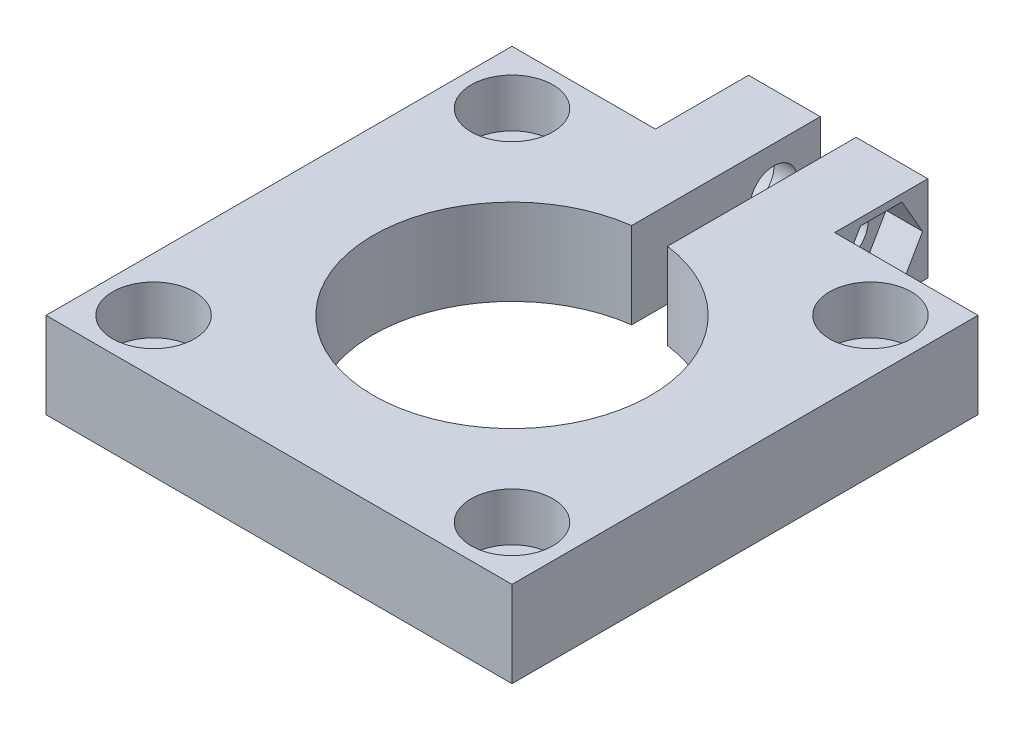
ISO-10303-21;
HEADER;
FILE_DESCRIPTION(('STEP AP214'),'2;1');
FILE_NAME('part.step','',(''),(''),'','','');
FILE_SCHEMA(('AUTOMOTIVE_DESIGN { 1 0 10303 214 1 1 1 1 }'));
ENDSEC;
DATA;
#1=APPLICATION_CONTEXT('core data for automotive mechanical design processes');
#2=APPLICATION_PROTOCOL_DEFINITION('international standard','automotive_design',2000,#1);
#3=PRODUCT_CONTEXT('',#1,'mechanical');
#4=PRODUCT('Part','Part','',(#3));
#5=PRODUCT_RELATED_PRODUCT_CATEGORY('part','',(#4));
#6=PRODUCT_DEFINITION_FORMATION('','',#4);
#7=PRODUCT_DEFINITION_CONTEXT('part definition',#1,'design');
#8=PRODUCT_DEFINITION('design','',#6,#7);
#9=PRODUCT_DEFINITION_SHAPE('','',#8);
#10=(LENGTH_UNIT() NAMED_UNIT(*) SI_UNIT(.MILLI.,.METRE.));
#11=(NAMED_UNIT(*) PLANE_ANGLE_UNIT() SI_UNIT($,.RADIAN.));
#12=(NAMED_UNIT(*) SI_UNIT($,.STERADIAN.) SOLID_ANGLE_UNIT());
#13=UNCERTAINTY_MEASURE_WITH_UNIT(LENGTH_MEASURE(1.E-05),#10,'distance_accuracy_value','');
#14=(GEOMETRIC_REPRESENTATION_CONTEXT(3) GLOBAL_UNCERTAINTY_ASSIGNED_CONTEXT((#13)) GLOBAL_UNIT_ASSIGNED_CONTEXT((#10,
#11,#12)) REPRESENTATION_CONTEXT('',''));
#15=CARTESIAN_POINT('',(0.,0.,0.));
#16=DIRECTION('',(0.,0.,1.));
#17=DIRECTION('',(1.,0.,0.));
#18=AXIS2_PLACEMENT_3D('',#15,#16,#17);
#19=CARTESIAN_POINT('',(-12.5,6.,-39.));
#20=DIRECTION('',(-1.,0.,0.));
#21=DIRECTION('',(0.,0.,1.));
#22=AXIS2_PLACEMENT_3D('',#19,#20,#21);
#23=CYLINDRICAL_SURFACE('',#22,3.3);
#24=CARTESIAN_POINT('',(2.5,6.,-39.));
#25=DIRECTION('',(1.,0.,0.));
#26=DIRECTION('',(0.,0.,-1.));
#27=AXIS2_PLACEMENT_3D('',#24,#25,#26);
#28=CIRCLE('',#27,3.3);
#29=CARTESIAN_POINT('',(2.5,6.,-42.3));
#30=VERTEX_POINT('',#29);
#31=EDGE_CURVE('E226',#30,#30,#28,.T.);
#32=ORIENTED_EDGE('',*,*,#31,.F.);
#33=EDGE_LOOP('',(#32));
#34=FACE_BOUND('',#33,.T.);
#35=CARTESIAN_POINT('',(7.4,6.,-39.));
#36=DIRECTION('',(1.,0.,0.));
#37=DIRECTION('',(0.,0.,-1.));
#38=AXIS2_PLACEMENT_3D('',#35,#36,#37);
#39=CIRCLE('',#38,3.3);
#40=CARTESIAN_POINT('',(7.4,6.,-42.3));
#41=VERTEX_POINT('',#40);
#42=EDGE_CURVE('E37',#41,#41,#39,.F.);
#43=ORIENTED_EDGE('',*,*,#42,.F.);
#44=EDGE_LOOP('',(#43));
#45=FACE_BOUND('',#44,.T.);
#46=ADVANCED_FACE('F33',(#34,#45),#23,.F.);
#47=CARTESIAN_POINT('',(-32.5,12.,-32.5));
#48=DIRECTION('',(0.,0.,1.));
#49=DIRECTION('',(1.,0.,0.));
#50=AXIS2_PLACEMENT_3D('',#47,#48,#49);
#51=PLANE('',#50);
#52=DIRECTION('',(-1.,0.,0.));
#53=VECTOR('',#52,1.);
#54=CARTESIAN_POINT('',(-32.5,0.,-32.5));
#55=LINE('',#54,#53);
#56=CARTESIAN_POINT('',(32.5,0.,-32.5));
#57=VERTEX_POINT('',#56);
#58=CARTESIAN_POINT('',(12.5,0.,-32.5));
#59=VERTEX_POINT('',#58);
#60=EDGE_CURVE('E301',#57,#59,#55,.T.);
#61=ORIENTED_EDGE('',*,*,#60,.T.);
#62=DIRECTION('',(0.,1.,0.));
#63=VECTOR('',#62,1.);
#64=CARTESIAN_POINT('',(12.5,0.,-32.5));
#65=LINE('',#64,#63);
#66=CARTESIAN_POINT('',(12.5,12.,-32.5));
#67=VERTEX_POINT('',#66);
#68=EDGE_CURVE('E57',#59,#67,#65,.T.);
#69=ORIENTED_EDGE('',*,*,#68,.T.);
#70=DIRECTION('',(-1.,0.,0.));
#71=VECTOR('',#70,1.);
#72=CARTESIAN_POINT('',(-32.5,12.,-32.5));
#73=LINE('',#72,#71);
#74=CARTESIAN_POINT('',(32.5,12.,-32.5));
#75=VERTEX_POINT('',#74);
#76=EDGE_CURVE('E291',#75,#67,#73,.T.);
#77=ORIENTED_EDGE('',*,*,#76,.F.);
#78=DIRECTION('',(0.,-1.,0.));
#79=VECTOR('',#78,1.);
#80=CARTESIAN_POINT('',(32.5,12.,-32.5));
#81=LINE('',#80,#79);
#82=EDGE_CURVE('E314',#75,#57,#81,.T.);
#83=ORIENTED_EDGE('',*,*,#82,.T.);
#84=EDGE_LOOP('',(#61,#69,#77,#83));
#85=FACE_BOUND('',#84,.T.);
#86=ADVANCED_FACE('F341',(#85),#51,.F.);
#87=CARTESIAN_POINT('',(32.5,12.,-32.5));
#88=DIRECTION('',(-1.,0.,0.));
#89=DIRECTION('',(0.,0.,1.));
#90=AXIS2_PLACEMENT_3D('',#87,#88,#89);
#91=PLANE('',#90);
#92=DIRECTION('',(0.,0.,-1.));
#93=VECTOR('',#92,1.);
#94=CARTESIAN_POINT('',(32.5,0.,-32.5));
#95=LINE('',#94,#93);
#96=CARTESIAN_POINT('',(32.5,0.,32.5));
#97=VERTEX_POINT('',#96);
#98=EDGE_CURVE('E283',#97,#57,#95,.T.);
#99=ORIENTED_EDGE('',*,*,#98,.T.);
#100=ORIENTED_EDGE('',*,*,#82,.F.);
#101=DIRECTION('',(0.,0.,-1.));
#102=VECTOR('',#101,1.);
#103=CARTESIAN_POINT('',(32.5,12.,-32.5));
#104=LINE('',#103,#102);
#105=CARTESIAN_POINT('',(32.5,12.,32.5));
#106=VERTEX_POINT('',#105);
#107=EDGE_CURVE('E286',#106,#75,#104,.T.);
#108=ORIENTED_EDGE('',*,*,#107,.F.);
#109=DIRECTION('',(0.,-1.,0.));
#110=VECTOR('',#109,1.);
#111=CARTESIAN_POINT('',(32.5,12.,32.5));
#112=LINE('',#111,#110);
#113=EDGE_CURVE('E297',#106,#97,#112,.T.);
#114=ORIENTED_EDGE('',*,*,#113,.T.);
#115=EDGE_LOOP('',(#99,#100,#108,#114));
#116=FACE_BOUND('',#115,.T.);
#117=ADVANCED_FACE('F35',(#116),#91,.F.);
#118=CARTESIAN_POINT('',(-12.5,12.,-32.5));
#119=VERTEX_POINT('',#118);
#120=CARTESIAN_POINT('',(-32.5,12.,-32.5));
#121=VERTEX_POINT('',#120);
#122=EDGE_CURVE('E289',#119,#121,#73,.T.);
#123=ORIENTED_EDGE('',*,*,#122,.F.);
#124=DIRECTION('',(0.,1.,0.));
#125=VECTOR('',#124,1.);
#126=CARTESIAN_POINT('',(-12.5,0.,-32.5));
#127=LINE('',#126,#125);
#128=CARTESIAN_POINT('',(-12.5,0.,-32.5));
#129=VERTEX_POINT('',#128);
#130=EDGE_CURVE('E263',#129,#119,#127,.T.);
#131=ORIENTED_EDGE('',*,*,#130,.F.);
#132=CARTESIAN_POINT('',(-32.5,0.,-32.5));
#133=VERTEX_POINT('',#132);
#134=EDGE_CURVE('E300',#129,#133,#55,.T.);
#135=ORIENTED_EDGE('',*,*,#134,.T.);
#136=DIRECTION('',(0.,-1.,0.));
#137=VECTOR('',#136,1.);
#138=CARTESIAN_POINT('',(-32.5,12.,-32.5));
#139=LINE('',#138,#137);
#140=EDGE_CURVE('E311',#121,#133,#139,.T.);
#141=ORIENTED_EDGE('',*,*,#140,.F.);
#142=EDGE_LOOP('',(#123,#131,#135,#141));
#143=FACE_BOUND('',#142,.T.);
#144=ADVANCED_FACE('F357',(#143),#51,.F.);
#145=CARTESIAN_POINT('',(-32.5,12.,-32.5));
#146=DIRECTION('',(1.,0.,0.));
#147=DIRECTION('',(0.,0.,-1.));
#148=AXIS2_PLACEMENT_3D('',#145,#146,#147);
#149=PLANE('',#148);
#150=DIRECTION('',(0.,0.,1.));
#151=VECTOR('',#150,1.);
#152=CARTESIAN_POINT('',(-32.5,0.,-32.5));
#153=LINE('',#152,#151);
#154=CARTESIAN_POINT('',(-32.5,0.,32.5));
#155=VERTEX_POINT('',#154);
#156=EDGE_CURVE('E303',#133,#155,#153,.T.);
#157=ORIENTED_EDGE('',*,*,#156,.T.);
#158=DIRECTION('',(0.,-1.,0.));
#159=VECTOR('',#158,1.);
#160=CARTESIAN_POINT('',(-32.5,12.,32.5));
#161=LINE('',#160,#159);
#162=CARTESIAN_POINT('',(-32.5,12.,32.5));
#163=VERTEX_POINT('',#162);
#164=EDGE_CURVE('E308',#163,#155,#161,.T.);
#165=ORIENTED_EDGE('',*,*,#164,.F.);
#166=DIRECTION('',(0.,0.,1.));
#167=VECTOR('',#166,1.);
#168=CARTESIAN_POINT('',(-32.5,12.,-32.5));
#169=LINE('',#168,#167);
#170=EDGE_CURVE('E293',#121,#163,#169,.T.);
#171=ORIENTED_EDGE('',*,*,#170,.F.);
#172=ORIENTED_EDGE('',*,*,#140,.T.);
#173=EDGE_LOOP('',(#157,#165,#171,#172));
#174=FACE_BOUND('',#173,.T.);
#175=ADVANCED_FACE('F354',(#174),#149,.F.);
#176=CARTESIAN_POINT('',(-32.5,12.,32.5));
#177=DIRECTION('',(0.,0.,-1.));
#178=DIRECTION('',(-1.,0.,0.));
#179=AXIS2_PLACEMENT_3D('',#176,#177,#178);
#180=PLANE('',#179);
#181=DIRECTION('',(1.,0.,0.));
#182=VECTOR('',#181,1.);
#183=CARTESIAN_POINT('',(-32.5,0.,32.5));
#184=LINE('',#183,#182);
#185=EDGE_CURVE('E290',#155,#97,#184,.T.);
#186=ORIENTED_EDGE('',*,*,#185,.T.);
#187=ORIENTED_EDGE('',*,*,#113,.F.);
#188=DIRECTION('',(1.,0.,0.));
#189=VECTOR('',#188,1.);
#190=CARTESIAN_POINT('',(-32.5,12.,32.5));
#191=LINE('',#190,#189);
#192=EDGE_CURVE('E295',#163,#106,#191,.T.);
#193=ORIENTED_EDGE('',*,*,#192,.F.);
#194=ORIENTED_EDGE('',*,*,#164,.T.);
#195=EDGE_LOOP('',(#186,#187,#193,#194));
#196=FACE_BOUND('',#195,.T.);
#197=ADVANCED_FACE('F349',(#196),#180,.F.);
#198=CARTESIAN_POINT('',(32.5,12.,32.5));
#199=DIRECTION('',(0.,1.,0.));
#200=DIRECTION('',(0.,0.,1.));
#201=AXIS2_PLACEMENT_3D('',#198,#199,#200);
#202=PLANE('',#201);
#203=CARTESIAN_POINT('',(-25.,12.,25.));
#204=DIRECTION('',(0.,1.,0.));
#205=DIRECTION('',(0.,0.,1.));
#206=AXIS2_PLACEMENT_3D('',#203,#204,#205);
#207=CIRCLE('',#206,5.7);
#208=CARTESIAN_POINT('',(-25.,12.,30.7));
#209=VERTEX_POINT('',#208);
#210=EDGE_CURVE('E511',#209,#209,#207,.T.);
#211=ORIENTED_EDGE('',*,*,#210,.F.);
#212=EDGE_LOOP('',(#211));
#213=FACE_BOUND('',#212,.T.);
#214=CARTESIAN_POINT('',(25.,12.,25.));
#215=DIRECTION('',(0.,1.,0.));
#216=DIRECTION('',(0.,0.,1.));
#217=AXIS2_PLACEMENT_3D('',#214,#215,#216);
#218=CIRCLE('',#217,5.7);
#219=CARTESIAN_POINT('',(25.,12.,30.7));
#220=VERTEX_POINT('',#219);
#221=EDGE_CURVE('E522',#220,#220,#218,.T.);
#222=ORIENTED_EDGE('',*,*,#221,.F.);
#223=EDGE_LOOP('',(#222));
#224=FACE_BOUND('',#223,.T.);
#225=CARTESIAN_POINT('',(25.,12.,-25.));
#226=DIRECTION('',(0.,1.,0.));
#227=DIRECTION('',(0.,0.,1.));
#228=AXIS2_PLACEMENT_3D('',#225,#226,#227);
#229=CIRCLE('',#228,5.7);
#230=CARTESIAN_POINT('',(25.,12.,-19.3));
#231=VERTEX_POINT('',#230);
#232=EDGE_CURVE('E534',#231,#231,#229,.T.);
#233=ORIENTED_EDGE('',*,*,#232,.F.);
#234=EDGE_LOOP('',(#233));
#235=FACE_BOUND('',#234,.T.);
#236=CARTESIAN_POINT('',(-25.,12.,-25.));
#237=DIRECTION('',(0.,1.,0.));
#238=DIRECTION('',(0.,0.,1.));
#239=AXIS2_PLACEMENT_3D('',#236,#237,#238);
#240=CIRCLE('',#239,5.7);
#241=CARTESIAN_POINT('',(-25.,12.,-19.3));
#242=VERTEX_POINT('',#241);
#243=EDGE_CURVE('E546',#242,#242,#240,.T.);
#244=ORIENTED_EDGE('',*,*,#243,.F.);
#245=EDGE_LOOP('',(#244));
#246=FACE_BOUND('',#245,.T.);
#247=DIRECTION('',(0.,0.,-1.));
#248=VECTOR('',#247,1.);
#249=CARTESIAN_POINT('',(2.5,12.,-52.5));
#250=LINE('',#249,#248);
#251=CARTESIAN_POINT('',(2.5,12.,-19.1878216585416));
#252=VERTEX_POINT('',#251);
#253=CARTESIAN_POINT('',(2.5,12.,-45.5));
#254=VERTEX_POINT('',#253);
#255=EDGE_CURVE('E266',#252,#254,#250,.T.);
#256=ORIENTED_EDGE('',*,*,#255,.F.);
#257=CARTESIAN_POINT('',(0.,12.,0.));
#258=DIRECTION('',(0.,1.,0.));
#259=DIRECTION('',(0.,0.,1.));
#260=AXIS2_PLACEMENT_3D('',#257,#258,#259);
#261=CIRCLE('',#260,19.35);
#262=CARTESIAN_POINT('',(-2.5,12.,-19.1878216585417));
#263=VERTEX_POINT('',#262);
#264=EDGE_CURVE('E277',#263,#252,#261,.T.);
#265=ORIENTED_EDGE('',*,*,#264,.F.);
#266=DIRECTION('',(0.,0.,1.));
#267=VECTOR('',#266,1.);
#268=CARTESIAN_POINT('',(-2.5,12.,-52.5));
#269=LINE('',#268,#267);
#270=CARTESIAN_POINT('',(-2.5,12.,-45.5));
#271=VERTEX_POINT('',#270);
#272=EDGE_CURVE('E274',#271,#263,#269,.T.);
#273=ORIENTED_EDGE('',*,*,#272,.F.);
#274=DIRECTION('',(-1.,0.,0.));
#275=VECTOR('',#274,1.);
#276=CARTESIAN_POINT('',(-2.5,12.,-45.5));
#277=LINE('',#276,#275);
#278=CARTESIAN_POINT('',(-12.5,12.,-45.5));
#279=VERTEX_POINT('',#278);
#280=EDGE_CURVE('E246',#271,#279,#277,.T.);
#281=ORIENTED_EDGE('',*,*,#280,.T.);
#282=DIRECTION('',(0.,0.,1.));
#283=VECTOR('',#282,1.);
#284=CARTESIAN_POINT('',(-12.5,12.,-32.5));
#285=LINE('',#284,#283);
#286=EDGE_CURVE('E255',#279,#119,#285,.T.);
#287=ORIENTED_EDGE('',*,*,#286,.T.);
#288=ORIENTED_EDGE('',*,*,#122,.T.);
#289=ORIENTED_EDGE('',*,*,#170,.T.);
#290=ORIENTED_EDGE('',*,*,#192,.T.);
#291=ORIENTED_EDGE('',*,*,#107,.T.);
#292=ORIENTED_EDGE('',*,*,#76,.T.);
#293=DIRECTION('',(0.,0.,-1.));
#294=VECTOR('',#293,1.);
#295=CARTESIAN_POINT('',(12.5,12.,-32.5));
#296=LINE('',#295,#294);
#297=CARTESIAN_POINT('',(12.5,12.,-45.5));
#298=VERTEX_POINT('',#297);
#299=EDGE_CURVE('E232',#67,#298,#296,.T.);
#300=ORIENTED_EDGE('',*,*,#299,.T.);
#301=DIRECTION('',(-1.,0.,0.));
#302=VECTOR('',#301,1.);
#303=CARTESIAN_POINT('',(12.5,12.,-45.5));
#304=LINE('',#303,#302);
#305=EDGE_CURVE('E237',#298,#254,#304,.T.);
#306=ORIENTED_EDGE('',*,*,#305,.T.);
#307=EDGE_LOOP('',(#256,#265,#273,#281,#287,#288,#289,#290,#291,#292,#300,#306));
#308=FACE_BOUND('',#307,.T.);
#309=ADVANCED_FACE('F325',(#213,#224,#235,#246,#308),#202,.T.);
#310=CARTESIAN_POINT('',(32.5,0.,32.5));
#311=DIRECTION('',(0.,1.,0.));
#312=DIRECTION('',(0.,0.,1.));
#313=AXIS2_PLACEMENT_3D('',#310,#311,#312);
#314=PLANE('',#313);
#315=CARTESIAN_POINT('',(-25.,0.,25.));
#316=DIRECTION('',(0.,1.,0.));
#317=DIRECTION('',(0.,0.,1.));
#318=AXIS2_PLACEMENT_3D('',#315,#316,#317);
#319=CIRCLE('',#318,3.75);
#320=CARTESIAN_POINT('',(-25.,0.,28.75));
#321=VERTEX_POINT('',#320);
#322=EDGE_CURVE('E519',#321,#321,#319,.T.);
#323=ORIENTED_EDGE('',*,*,#322,.T.);
#324=EDGE_LOOP('',(#323));
#325=FACE_BOUND('',#324,.T.);
#326=CARTESIAN_POINT('',(25.,0.,25.));
#327=DIRECTION('',(0.,1.,0.));
#328=DIRECTION('',(0.,0.,1.));
#329=AXIS2_PLACEMENT_3D('',#326,#327,#328);
#330=CIRCLE('',#329,3.75);
#331=CARTESIAN_POINT('',(25.,0.,28.75));
#332=VERTEX_POINT('',#331);
#333=EDGE_CURVE('E531',#332,#332,#330,.T.);
#334=ORIENTED_EDGE('',*,*,#333,.T.);
#335=EDGE_LOOP('',(#334));
#336=FACE_BOUND('',#335,.T.);
#337=CARTESIAN_POINT('',(25.,0.,-25.));
#338=DIRECTION('',(0.,1.,0.));
#339=DIRECTION('',(0.,0.,1.));
#340=AXIS2_PLACEMENT_3D('',#337,#338,#339);
#341=CIRCLE('',#340,3.75);
#342=CARTESIAN_POINT('',(25.,0.,-21.25));
#343=VERTEX_POINT('',#342);
#344=EDGE_CURVE('E543',#343,#343,#341,.T.);
#345=ORIENTED_EDGE('',*,*,#344,.T.);
#346=EDGE_LOOP('',(#345));
#347=FACE_BOUND('',#346,.T.);
#348=CARTESIAN_POINT('',(-25.,0.,-25.));
#349=DIRECTION('',(0.,1.,0.));
#350=DIRECTION('',(0.,0.,1.));
#351=AXIS2_PLACEMENT_3D('',#348,#349,#350);
#352=CIRCLE('',#351,3.75);
#353=CARTESIAN_POINT('',(-25.,0.,-21.25));
#354=VERTEX_POINT('',#353);
#355=EDGE_CURVE('E187',#354,#354,#352,.T.);
#356=ORIENTED_EDGE('',*,*,#355,.T.);
#357=EDGE_LOOP('',(#356));
#358=FACE_BOUND('',#357,.T.);
#359=CARTESIAN_POINT('',(0.,0.,0.));
#360=DIRECTION('',(0.,1.,0.));
#361=DIRECTION('',(0.,0.,1.));
#362=AXIS2_PLACEMENT_3D('',#359,#360,#361);
#363=CIRCLE('',#362,19.35);
#364=CARTESIAN_POINT('',(-2.5,0.,-19.1878216585416));
#365=VERTEX_POINT('',#364);
#366=CARTESIAN_POINT('',(2.5,0.,-19.1878216585417));
#367=VERTEX_POINT('',#366);
#368=EDGE_CURVE('E280',#365,#367,#363,.T.);
#369=ORIENTED_EDGE('',*,*,#368,.T.);
#370=DIRECTION('',(0.,0.,-1.));
#371=VECTOR('',#370,1.);
#372=CARTESIAN_POINT('',(2.5,0.,-52.5));
#373=LINE('',#372,#371);
#374=CARTESIAN_POINT('',(2.5,0.,-45.5));
#375=VERTEX_POINT('',#374);
#376=EDGE_CURVE('E271',#367,#375,#373,.T.);
#377=ORIENTED_EDGE('',*,*,#376,.T.);
#378=DIRECTION('',(-1.,0.,0.));
#379=VECTOR('',#378,1.);
#380=CARTESIAN_POINT('',(12.5,0.,-45.5));
#381=LINE('',#380,#379);
#382=CARTESIAN_POINT('',(12.5,0.,-45.5));
#383=VERTEX_POINT('',#382);
#384=EDGE_CURVE('E236',#383,#375,#381,.T.);
#385=ORIENTED_EDGE('',*,*,#384,.F.);
#386=DIRECTION('',(0.,0.,-1.));
#387=VECTOR('',#386,1.);
#388=CARTESIAN_POINT('',(12.5,0.,-32.5));
#389=LINE('',#388,#387);
#390=EDGE_CURVE('E233',#59,#383,#389,.T.);
#391=ORIENTED_EDGE('',*,*,#390,.F.);
#392=ORIENTED_EDGE('',*,*,#60,.F.);
#393=ORIENTED_EDGE('',*,*,#98,.F.);
#394=ORIENTED_EDGE('',*,*,#185,.F.);
#395=ORIENTED_EDGE('',*,*,#156,.F.);
#396=ORIENTED_EDGE('',*,*,#134,.F.);
#397=DIRECTION('',(0.,0.,1.));
#398=VECTOR('',#397,1.);
#399=CARTESIAN_POINT('',(-12.5,0.,-32.5));
#400=LINE('',#399,#398);
#401=CARTESIAN_POINT('',(-12.5,0.,-45.5));
#402=VERTEX_POINT('',#401);
#403=EDGE_CURVE('E254',#402,#129,#400,.T.);
#404=ORIENTED_EDGE('',*,*,#403,.F.);
#405=DIRECTION('',(-1.,0.,0.));
#406=VECTOR('',#405,1.);
#407=CARTESIAN_POINT('',(-2.5,0.,-45.5));
#408=LINE('',#407,#406);
#409=CARTESIAN_POINT('',(-2.5,0.,-45.5));
#410=VERTEX_POINT('',#409);
#411=EDGE_CURVE('E251',#410,#402,#408,.T.);
#412=ORIENTED_EDGE('',*,*,#411,.F.);
#413=DIRECTION('',(0.,0.,1.));
#414=VECTOR('',#413,1.);
#415=CARTESIAN_POINT('',(-2.5,0.,-52.5));
#416=LINE('',#415,#414);
#417=EDGE_CURVE('E273',#410,#365,#416,.T.);
#418=ORIENTED_EDGE('',*,*,#417,.T.);
#419=EDGE_LOOP('',(#369,#377,#385,#391,#392,#393,#394,#395,#396,#404,#412,#418));
#420=FACE_BOUND('',#419,.T.);
#421=ADVANCED_FACE('F335',(#325,#336,#347,#358,#420),#314,.F.);
#422=CARTESIAN_POINT('',(0.,0.,0.));
#423=DIRECTION('',(0.,1.,0.));
#424=DIRECTION('',(0.,0.,1.));
#425=AXIS2_PLACEMENT_3D('',#422,#423,#424);
#426=CYLINDRICAL_SURFACE('',#425,19.35);
#427=ORIENTED_EDGE('',*,*,#264,.T.);
#428=DIRECTION('',(0.,1.,0.));
#429=VECTOR('',#428,1.);
#430=CARTESIAN_POINT('',(2.5,0.,-19.1878216585416));
#431=LINE('',#430,#429);
#432=EDGE_CURVE('E11',#252,#367,#431,.F.);
#433=ORIENTED_EDGE('',*,*,#432,.T.);
#434=ORIENTED_EDGE('',*,*,#368,.F.);
#435=DIRECTION('',(0.,1.,0.));
#436=VECTOR('',#435,1.);
#437=CARTESIAN_POINT('',(-2.5,0.,-19.1878216585416));
#438=LINE('',#437,#436);
#439=EDGE_CURVE('E42',#365,#263,#438,.T.);
#440=ORIENTED_EDGE('',*,*,#439,.T.);
#441=EDGE_LOOP('',(#427,#433,#434,#440));
#442=FACE_BOUND('',#441,.T.);
#443=ADVANCED_FACE('F321',(#442),#426,.F.);
#444=CARTESIAN_POINT('',(-2.5,0.,-52.5));
#445=DIRECTION('',(-1.,0.,0.));
#446=DIRECTION('',(0.,0.,1.));
#447=AXIS2_PLACEMENT_3D('',#444,#445,#446);
#448=PLANE('',#447);
#449=CARTESIAN_POINT('',(-2.5,6.,-39.));
#450=DIRECTION('',(-1.,0.,0.));
#451=DIRECTION('',(0.,0.,1.));
#452=AXIS2_PLACEMENT_3D('',#449,#450,#451);
#453=CIRCLE('',#452,3.3);
#454=CARTESIAN_POINT('',(-2.5,6.,-35.7));
#455=VERTEX_POINT('',#454);
#456=EDGE_CURVE('E229',#455,#455,#453,.T.);
#457=ORIENTED_EDGE('',*,*,#456,.T.);
#458=EDGE_LOOP('',(#457));
#459=FACE_BOUND('',#458,.T.);
#460=ORIENTED_EDGE('',*,*,#272,.T.);
#461=ORIENTED_EDGE('',*,*,#439,.F.);
#462=ORIENTED_EDGE('',*,*,#417,.F.);
#463=DIRECTION('',(0.,1.,0.));
#464=VECTOR('',#463,1.);
#465=CARTESIAN_POINT('',(-2.5,0.,-45.5));
#466=LINE('',#465,#464);
#467=EDGE_CURVE('E258',#410,#271,#466,.T.);
#468=ORIENTED_EDGE('',*,*,#467,.T.);
#469=EDGE_LOOP('',(#460,#461,#462,#468));
#470=FACE_BOUND('',#469,.T.);
#471=ADVANCED_FACE('F367',(#459,#470),#448,.F.);
#472=CARTESIAN_POINT('',(2.5,0.,-52.5));
#473=DIRECTION('',(1.,0.,0.));
#474=DIRECTION('',(0.,0.,-1.));
#475=AXIS2_PLACEMENT_3D('',#472,#473,#474);
#476=PLANE('',#475);
#477=ORIENTED_EDGE('',*,*,#31,.T.);
#478=EDGE_LOOP('',(#477));
#479=FACE_BOUND('',#478,.T.);
#480=ORIENTED_EDGE('',*,*,#376,.F.);
#481=ORIENTED_EDGE('',*,*,#432,.F.);
#482=ORIENTED_EDGE('',*,*,#255,.T.);
#483=DIRECTION('',(0.,1.,0.));
#484=VECTOR('',#483,1.);
#485=CARTESIAN_POINT('',(2.5,0.,-45.5));
#486=LINE('',#485,#484);
#487=EDGE_CURVE('E247',#375,#254,#486,.T.);
#488=ORIENTED_EDGE('',*,*,#487,.F.);
#489=EDGE_LOOP('',(#480,#481,#482,#488));
#490=FACE_BOUND('',#489,.T.);
#491=ADVANCED_FACE('F329',(#479,#490),#476,.F.);
#492=CARTESIAN_POINT('',(-12.5,0.,-32.5));
#493=DIRECTION('',(-1.,0.,0.));
#494=DIRECTION('',(0.,0.,1.));
#495=AXIS2_PLACEMENT_3D('',#492,#493,#494);
#496=PLANE('',#495);
#497=CARTESIAN_POINT('',(-12.5,6.,-39.));
#498=DIRECTION('',(-1.,0.,0.));
#499=DIRECTION('',(0.,0.,1.));
#500=AXIS2_PLACEMENT_3D('',#497,#498,#499);
#501=CIRCLE('',#500,5.25);
#502=CARTESIAN_POINT('',(-12.5,6.,-33.75));
#503=VERTEX_POINT('',#502);
#504=EDGE_CURVE('E217',#503,#503,#501,.T.);
#505=ORIENTED_EDGE('',*,*,#504,.F.);
#506=EDGE_LOOP('',(#505));
#507=FACE_BOUND('',#506,.T.);
#508=ORIENTED_EDGE('',*,*,#286,.F.);
#509=DIRECTION('',(0.,1.,0.));
#510=VECTOR('',#509,1.);
#511=CARTESIAN_POINT('',(-12.5,0.,-45.5));
#512=LINE('',#511,#510);
#513=EDGE_CURVE('E267',#402,#279,#512,.T.);
#514=ORIENTED_EDGE('',*,*,#513,.F.);
#515=ORIENTED_EDGE('',*,*,#403,.T.);
#516=ORIENTED_EDGE('',*,*,#130,.T.);
#517=EDGE_LOOP('',(#508,#514,#515,#516));
#518=FACE_BOUND('',#517,.T.);
#519=ADVANCED_FACE('F362',(#507,#518),#496,.T.);
#520=CARTESIAN_POINT('',(-2.5,0.,-45.5));
#521=DIRECTION('',(0.,0.,-1.));
#522=DIRECTION('',(-1.,0.,0.));
#523=AXIS2_PLACEMENT_3D('',#520,#521,#522);
#524=PLANE('',#523);
#525=ORIENTED_EDGE('',*,*,#280,.F.);
#526=ORIENTED_EDGE('',*,*,#467,.F.);
#527=ORIENTED_EDGE('',*,*,#411,.T.);
#528=ORIENTED_EDGE('',*,*,#513,.T.);
#529=EDGE_LOOP('',(#525,#526,#527,#528));
#530=FACE_BOUND('',#529,.T.);
#531=ADVANCED_FACE('F365',(#530),#524,.T.);
#532=CARTESIAN_POINT('',(12.5,0.,-32.5));
#533=DIRECTION('',(1.,0.,0.));
#534=DIRECTION('',(0.,0.,-1.));
#535=AXIS2_PLACEMENT_3D('',#532,#533,#534);
#536=PLANE('',#535);
#537=DIRECTION('',(0.,0.866025403784439,-0.5));
#538=VECTOR('',#537,1.);
#539=CARTESIAN_POINT('',(12.5,1.,-41.8867513459481));
#540=LINE('',#539,#538);
#541=CARTESIAN_POINT('',(12.5,1.,-41.8867513459481));
#542=VERTEX_POINT('',#541);
#543=CARTESIAN_POINT('',(12.5,6.,-44.7735026918963));
#544=VERTEX_POINT('',#543);
#545=EDGE_CURVE('E49',#542,#544,#540,.T.);
#546=ORIENTED_EDGE('',*,*,#545,.F.);
#547=DIRECTION('',(0.,0.,-1.));
#548=VECTOR('',#547,1.);
#549=CARTESIAN_POINT('',(12.5,1.,-36.1132486540519));
#550=LINE('',#549,#548);
#551=CARTESIAN_POINT('',(12.5,1.,-36.1132486540519));
#552=VERTEX_POINT('',#551);
#553=EDGE_CURVE('E181',#552,#542,#550,.T.);
#554=ORIENTED_EDGE('',*,*,#553,.F.);
#555=DIRECTION('',(0.,-0.866025403784439,-0.5));
#556=VECTOR('',#555,1.);
#557=CARTESIAN_POINT('',(12.5,6.,-33.2264973081037));
#558=LINE('',#557,#556);
#559=CARTESIAN_POINT('',(12.5,6.,-33.2264973081037));
#560=VERTEX_POINT('',#559);
#561=EDGE_CURVE('E184',#560,#552,#558,.T.);
#562=ORIENTED_EDGE('',*,*,#561,.F.);
#563=DIRECTION('',(0.,-0.866025403784439,0.5));
#564=VECTOR('',#563,1.);
#565=CARTESIAN_POINT('',(12.5,11.,-36.1132486540519));
#566=LINE('',#565,#564);
#567=CARTESIAN_POINT('',(12.5,11.,-36.1132486540519));
#568=VERTEX_POINT('',#567);
#569=EDGE_CURVE('E203',#568,#560,#566,.T.);
#570=ORIENTED_EDGE('',*,*,#569,.F.);
#571=DIRECTION('',(0.,0.,1.));
#572=VECTOR('',#571,1.);
#573=CARTESIAN_POINT('',(12.5,11.,-41.8867513459481));
#574=LINE('',#573,#572);
#575=CARTESIAN_POINT('',(12.5,11.,-41.8867513459481));
#576=VERTEX_POINT('',#575);
#577=EDGE_CURVE('E200',#576,#568,#574,.T.);
#578=ORIENTED_EDGE('',*,*,#577,.F.);
#579=DIRECTION('',(0.,0.866025403784439,0.5));
#580=VECTOR('',#579,1.);
#581=CARTESIAN_POINT('',(12.5,6.,-44.7735026918963));
#582=LINE('',#581,#580);
#583=EDGE_CURVE('E198',#544,#576,#582,.T.);
#584=ORIENTED_EDGE('',*,*,#583,.F.);
#585=EDGE_LOOP('',(#546,#554,#562,#570,#578,#584));
#586=FACE_BOUND('',#585,.T.);
#587=ORIENTED_EDGE('',*,*,#299,.F.);
#588=ORIENTED_EDGE('',*,*,#68,.F.);
#589=ORIENTED_EDGE('',*,*,#390,.T.);
#590=DIRECTION('',(0.,1.,0.));
#591=VECTOR('',#590,1.);
#592=CARTESIAN_POINT('',(12.5,0.,-45.5));
#593=LINE('',#592,#591);
#594=EDGE_CURVE('E240',#383,#298,#593,.T.);
#595=ORIENTED_EDGE('',*,*,#594,.T.);
#596=EDGE_LOOP('',(#587,#588,#589,#595));
#597=FACE_BOUND('',#596,.T.);
#598=ADVANCED_FACE('F338',(#586,#597),#536,.T.);
#599=CARTESIAN_POINT('',(12.5,0.,-45.5));
#600=DIRECTION('',(0.,0.,-1.));
#601=DIRECTION('',(-1.,0.,0.));
#602=AXIS2_PLACEMENT_3D('',#599,#600,#601);
#603=PLANE('',#602);
#604=ORIENTED_EDGE('',*,*,#305,.F.);
#605=ORIENTED_EDGE('',*,*,#594,.F.);
#606=ORIENTED_EDGE('',*,*,#384,.T.);
#607=ORIENTED_EDGE('',*,*,#487,.T.);
#608=EDGE_LOOP('',(#604,#605,#606,#607));
#609=FACE_BOUND('',#608,.T.);
#610=ADVANCED_FACE('F331',(#609),#603,.T.);
#611=CARTESIAN_POINT('',(-5.75,6.,-39.));
#612=DIRECTION('',(-1.,0.,0.));
#613=DIRECTION('',(0.,0.,1.));
#614=AXIS2_PLACEMENT_3D('',#611,#612,#613);
#615=CIRCLE('',#614,3.3);
#616=CARTESIAN_POINT('',(-5.75,6.,-35.7));
#617=VERTEX_POINT('',#616);
#618=EDGE_CURVE('E223',#617,#617,#615,.T.);
#619=ORIENTED_EDGE('',*,*,#618,.T.);
#620=EDGE_LOOP('',(#619));
#621=FACE_BOUND('',#620,.T.);
#622=ORIENTED_EDGE('',*,*,#456,.F.);
#623=EDGE_LOOP('',(#622));
#624=FACE_BOUND('',#623,.T.);
#625=ADVANCED_FACE('F382',(#621,#624),#23,.F.);
#626=CARTESIAN_POINT('',(-5.75,9.3,-39.));
#627=DIRECTION('',(1.,0.,0.));
#628=DIRECTION('',(0.,0.,-1.));
#629=AXIS2_PLACEMENT_3D('',#626,#627,#628);
#630=PLANE('',#629);
#631=ORIENTED_EDGE('',*,*,#618,.F.);
#632=EDGE_LOOP('',(#631));
#633=FACE_BOUND('',#632,.T.);
#634=CARTESIAN_POINT('',(-5.75,6.,-39.));
#635=DIRECTION('',(-1.,0.,0.));
#636=DIRECTION('',(0.,0.,1.));
#637=AXIS2_PLACEMENT_3D('',#634,#635,#636);
#638=CIRCLE('',#637,5.25);
#639=CARTESIAN_POINT('',(-5.75,6.,-33.75));
#640=VERTEX_POINT('',#639);
#641=EDGE_CURVE('E220',#640,#640,#638,.T.);
#642=ORIENTED_EDGE('',*,*,#641,.T.);
#643=EDGE_LOOP('',(#642));
#644=FACE_BOUND('',#643,.T.);
#645=ADVANCED_FACE('F391',(#633,#644),#630,.F.);
#646=CARTESIAN_POINT('',(-12.5,6.,-39.));
#647=DIRECTION('',(-1.,0.,0.));
#648=DIRECTION('',(0.,0.,1.));
#649=AXIS2_PLACEMENT_3D('',#646,#647,#648);
#650=CYLINDRICAL_SURFACE('',#649,5.25);
#651=ORIENTED_EDGE('',*,*,#641,.F.);
#652=EDGE_LOOP('',(#651));
#653=FACE_BOUND('',#652,.T.);
#654=ORIENTED_EDGE('',*,*,#504,.T.);
#655=EDGE_LOOP('',(#654));
#656=FACE_BOUND('',#655,.T.);
#657=ADVANCED_FACE('F397',(#653,#656),#650,.F.);
#658=CARTESIAN_POINT('',(7.4,6.,-44.7735026918963));
#659=DIRECTION('',(1.,0.,0.));
#660=DIRECTION('',(0.,0.,-1.));
#661=AXIS2_PLACEMENT_3D('',#658,#659,#660);
#662=PLANE('',#661);
#663=DIRECTION('',(0.,0.866025403784439,-0.5));
#664=VECTOR('',#663,1.);
#665=CARTESIAN_POINT('',(7.4,1.,-41.8867513459481));
#666=LINE('',#665,#664);
#667=CARTESIAN_POINT('',(7.4,1.,-41.8867513459481));
#668=VERTEX_POINT('',#667);
#669=CARTESIAN_POINT('',(7.4,6.,-44.7735026918963));
#670=VERTEX_POINT('',#669);
#671=EDGE_CURVE('E161',#668,#670,#666,.T.);
#672=ORIENTED_EDGE('',*,*,#671,.T.);
#673=DIRECTION('',(0.,0.866025403784439,0.5));
#674=VECTOR('',#673,1.);
#675=CARTESIAN_POINT('',(7.4,6.,-44.7735026918963));
#676=LINE('',#675,#674);
#677=CARTESIAN_POINT('',(7.4,11.,-41.8867513459481));
#678=VERTEX_POINT('',#677);
#679=EDGE_CURVE('E170',#670,#678,#676,.T.);
#680=ORIENTED_EDGE('',*,*,#679,.T.);
#681=DIRECTION('',(0.,0.,1.));
#682=VECTOR('',#681,1.);
#683=CARTESIAN_POINT('',(7.4,11.,-41.8867513459481));
#684=LINE('',#683,#682);
#685=CARTESIAN_POINT('',(7.4,11.,-36.1132486540519));
#686=VERTEX_POINT('',#685);
#687=EDGE_CURVE('E175',#678,#686,#684,.T.);
#688=ORIENTED_EDGE('',*,*,#687,.T.);
#689=DIRECTION('',(0.,-0.866025403784439,0.5));
#690=VECTOR('',#689,1.);
#691=CARTESIAN_POINT('',(7.4,11.,-36.1132486540519));
#692=LINE('',#691,#690);
#693=CARTESIAN_POINT('',(7.4,6.,-33.2264973081037));
#694=VERTEX_POINT('',#693);
#695=EDGE_CURVE('E191',#686,#694,#692,.T.);
#696=ORIENTED_EDGE('',*,*,#695,.T.);
#697=DIRECTION('',(0.,-0.866025403784439,-0.5));
#698=VECTOR('',#697,1.);
#699=CARTESIAN_POINT('',(7.4,6.,-33.2264973081037));
#700=LINE('',#699,#698);
#701=CARTESIAN_POINT('',(7.4,1.,-36.1132486540519));
#702=VERTEX_POINT('',#701);
#703=EDGE_CURVE('E194',#694,#702,#700,.T.);
#704=ORIENTED_EDGE('',*,*,#703,.T.);
#705=DIRECTION('',(0.,0.,-1.));
#706=VECTOR('',#705,1.);
#707=CARTESIAN_POINT('',(7.4,1.,-36.1132486540519));
#708=LINE('',#707,#706);
#709=EDGE_CURVE('E167',#702,#668,#708,.T.);
#710=ORIENTED_EDGE('',*,*,#709,.T.);
#711=EDGE_LOOP('',(#672,#680,#688,#696,#704,#710));
#712=FACE_BOUND('',#711,.T.);
#713=ORIENTED_EDGE('',*,*,#42,.T.);
#714=EDGE_LOOP('',(#713));
#715=FACE_BOUND('',#714,.T.);
#716=ADVANCED_FACE('F177',(#712,#715),#662,.T.);
#717=CARTESIAN_POINT('',(7.4,1.,-41.8867513459481));
#718=DIRECTION('',(0.,-0.5,-0.866025403784439));
#719=DIRECTION('',(0.,0.866025403784439,-0.5));
#720=AXIS2_PLACEMENT_3D('',#717,#718,#719);
#721=PLANE('',#720);
#722=ORIENTED_EDGE('',*,*,#545,.T.);
#723=DIRECTION('',(1.,0.,0.));
#724=VECTOR('',#723,1.);
#725=CARTESIAN_POINT('',(7.4,6.,-44.7735026918963));
#726=LINE('',#725,#724);
#727=EDGE_CURVE('E157',#670,#544,#726,.T.);
#728=ORIENTED_EDGE('',*,*,#727,.F.);
#729=ORIENTED_EDGE('',*,*,#671,.F.);
#730=DIRECTION('',(1.,0.,0.));
#731=VECTOR('',#730,1.);
#732=CARTESIAN_POINT('',(7.4,1.,-41.8867513459481));
#733=LINE('',#732,#731);
#734=EDGE_CURVE('E208',#668,#542,#733,.T.);
#735=ORIENTED_EDGE('',*,*,#734,.T.);
#736=EDGE_LOOP('',(#722,#728,#729,#735));
#737=FACE_BOUND('',#736,.T.);
#738=ADVANCED_FACE('F159',(#737),#721,.F.);
#739=CARTESIAN_POINT('',(7.4,1.,-36.1132486540519));
#740=DIRECTION('',(0.,-1.,0.));
#741=DIRECTION('',(0.,0.,-1.));
#742=AXIS2_PLACEMENT_3D('',#739,#740,#741);
#743=PLANE('',#742);
#744=ORIENTED_EDGE('',*,*,#553,.T.);
#745=ORIENTED_EDGE('',*,*,#734,.F.);
#746=ORIENTED_EDGE('',*,*,#709,.F.);
#747=DIRECTION('',(1.,0.,0.));
#748=VECTOR('',#747,1.);
#749=CARTESIAN_POINT('',(7.4,1.,-36.1132486540519));
#750=LINE('',#749,#748);
#751=EDGE_CURVE('E210',#702,#552,#750,.T.);
#752=ORIENTED_EDGE('',*,*,#751,.T.);
#753=EDGE_LOOP('',(#744,#745,#746,#752));
#754=FACE_BOUND('',#753,.T.);
#755=ADVANCED_FACE('F433',(#754),#743,.F.);
#756=CARTESIAN_POINT('',(7.4,6.,-33.2264973081037));
#757=DIRECTION('',(0.,-0.5,0.866025403784439));
#758=DIRECTION('',(0.,-0.866025403784439,-0.5));
#759=AXIS2_PLACEMENT_3D('',#756,#757,#758);
#760=PLANE('',#759);
#761=ORIENTED_EDGE('',*,*,#561,.T.);
#762=ORIENTED_EDGE('',*,*,#751,.F.);
#763=ORIENTED_EDGE('',*,*,#703,.F.);
#764=DIRECTION('',(1.,0.,0.));
#765=VECTOR('',#764,1.);
#766=CARTESIAN_POINT('',(7.4,6.,-33.2264973081037));
#767=LINE('',#766,#765);
#768=EDGE_CURVE('E212',#694,#560,#767,.T.);
#769=ORIENTED_EDGE('',*,*,#768,.T.);
#770=EDGE_LOOP('',(#761,#762,#763,#769));
#771=FACE_BOUND('',#770,.T.);
#772=ADVANCED_FACE('F431',(#771),#760,.F.);
#773=CARTESIAN_POINT('',(7.4,11.,-36.1132486540519));
#774=DIRECTION('',(0.,0.5,0.866025403784439));
#775=DIRECTION('',(0.,-0.866025403784439,0.5));
#776=AXIS2_PLACEMENT_3D('',#773,#774,#775);
#777=PLANE('',#776);
#778=ORIENTED_EDGE('',*,*,#569,.T.);
#779=ORIENTED_EDGE('',*,*,#768,.F.);
#780=ORIENTED_EDGE('',*,*,#695,.F.);
#781=DIRECTION('',(1.,0.,0.));
#782=VECTOR('',#781,1.);
#783=CARTESIAN_POINT('',(7.4,11.,-36.1132486540519));
#784=LINE('',#783,#782);
#785=EDGE_CURVE('E214',#686,#568,#784,.T.);
#786=ORIENTED_EDGE('',*,*,#785,.T.);
#787=EDGE_LOOP('',(#778,#779,#780,#786));
#788=FACE_BOUND('',#787,.T.);
#789=ADVANCED_FACE('F429',(#788),#777,.F.);
#790=CARTESIAN_POINT('',(7.4,11.,-41.8867513459481));
#791=DIRECTION('',(0.,1.,0.));
#792=DIRECTION('',(0.,0.,1.));
#793=AXIS2_PLACEMENT_3D('',#790,#791,#792);
#794=PLANE('',#793);
#795=ORIENTED_EDGE('',*,*,#577,.T.);
#796=ORIENTED_EDGE('',*,*,#785,.F.);
#797=ORIENTED_EDGE('',*,*,#687,.F.);
#798=DIRECTION('',(1.,0.,0.));
#799=VECTOR('',#798,1.);
#800=CARTESIAN_POINT('',(7.4,11.,-41.8867513459481));
#801=LINE('',#800,#799);
#802=EDGE_CURVE('E166',#678,#576,#801,.T.);
#803=ORIENTED_EDGE('',*,*,#802,.T.);
#804=EDGE_LOOP('',(#795,#796,#797,#803));
#805=FACE_BOUND('',#804,.T.);
#806=ADVANCED_FACE('F425',(#805),#794,.F.);
#807=CARTESIAN_POINT('',(7.4,6.,-44.7735026918963));
#808=DIRECTION('',(0.,0.5,-0.866025403784439));
#809=DIRECTION('',(0.,0.866025403784439,0.5));
#810=AXIS2_PLACEMENT_3D('',#807,#808,#809);
#811=PLANE('',#810);
#812=ORIENTED_EDGE('',*,*,#583,.T.);
#813=ORIENTED_EDGE('',*,*,#802,.F.);
#814=ORIENTED_EDGE('',*,*,#679,.F.);
#815=ORIENTED_EDGE('',*,*,#727,.T.);
#816=EDGE_LOOP('',(#812,#813,#814,#815));
#817=FACE_BOUND('',#816,.T.);
#818=ADVANCED_FACE('F171',(#817),#811,.F.);
#819=CARTESIAN_POINT('',(-25.,12.,-25.));
#820=DIRECTION('',(0.,1.,0.));
#821=DIRECTION('',(0.,0.,1.));
#822=AXIS2_PLACEMENT_3D('',#819,#820,#821);
#823=CYLINDRICAL_SURFACE('',#822,3.75);
#824=ORIENTED_EDGE('',*,*,#355,.F.);
#825=EDGE_LOOP('',(#824));
#826=FACE_BOUND('',#825,.T.);
#827=CARTESIAN_POINT('',(-25.,5.25,-25.));
#828=DIRECTION('',(0.,1.,0.));
#829=DIRECTION('',(0.,0.,1.));
#830=AXIS2_PLACEMENT_3D('',#827,#828,#829);
#831=CIRCLE('',#830,3.75);
#832=CARTESIAN_POINT('',(-25.,5.25,-21.25));
#833=VERTEX_POINT('',#832);
#834=EDGE_CURVE('E551',#833,#833,#831,.T.);
#835=ORIENTED_EDGE('',*,*,#834,.T.);
#836=EDGE_LOOP('',(#835));
#837=FACE_BOUND('',#836,.T.);
#838=ADVANCED_FACE('F450',(#826,#837),#823,.F.);
#839=CARTESIAN_POINT('',(-21.25,5.25,-25.));
#840=DIRECTION('',(0.,-1.,0.));
#841=DIRECTION('',(0.,0.,-1.));
#842=AXIS2_PLACEMENT_3D('',#839,#840,#841);
#843=PLANE('',#842);
#844=ORIENTED_EDGE('',*,*,#834,.F.);
#845=EDGE_LOOP('',(#844));
#846=FACE_BOUND('',#845,.T.);
#847=CARTESIAN_POINT('',(-25.,5.25,-25.));
#848=DIRECTION('',(0.,1.,0.));
#849=DIRECTION('',(0.,0.,1.));
#850=AXIS2_PLACEMENT_3D('',#847,#848,#849);
#851=CIRCLE('',#850,5.7);
#852=CARTESIAN_POINT('',(-25.,5.25,-19.3));
#853=VERTEX_POINT('',#852);
#854=EDGE_CURVE('E549',#853,#853,#851,.T.);
#855=ORIENTED_EDGE('',*,*,#854,.T.);
#856=EDGE_LOOP('',(#855));
#857=FACE_BOUND('',#856,.T.);
#858=ADVANCED_FACE('F454',(#846,#857),#843,.F.);
#859=CARTESIAN_POINT('',(-25.,12.,-25.));
#860=DIRECTION('',(0.,1.,0.));
#861=DIRECTION('',(0.,0.,1.));
#862=AXIS2_PLACEMENT_3D('',#859,#860,#861);
#863=CYLINDRICAL_SURFACE('',#862,5.7);
#864=ORIENTED_EDGE('',*,*,#854,.F.);
#865=EDGE_LOOP('',(#864));
#866=FACE_BOUND('',#865,.T.);
#867=ORIENTED_EDGE('',*,*,#243,.T.);
#868=EDGE_LOOP('',(#867));
#869=FACE_BOUND('',#868,.T.);
#870=ADVANCED_FACE('F459',(#866,#869),#863,.F.);
#871=CARTESIAN_POINT('',(25.,12.,-25.));
#872=DIRECTION('',(0.,1.,0.));
#873=DIRECTION('',(0.,0.,1.));
#874=AXIS2_PLACEMENT_3D('',#871,#872,#873);
#875=CYLINDRICAL_SURFACE('',#874,3.75000000000001);
#876=ORIENTED_EDGE('',*,*,#344,.F.);
#877=EDGE_LOOP('',(#876));
#878=FACE_BOUND('',#877,.T.);
#879=CARTESIAN_POINT('',(25.,5.25,-25.));
#880=DIRECTION('',(0.,1.,0.));
#881=DIRECTION('',(0.,0.,1.));
#882=AXIS2_PLACEMENT_3D('',#879,#880,#881);
#883=CIRCLE('',#882,3.75000000000001);
#884=CARTESIAN_POINT('',(25.,5.25,-21.25));
#885=VERTEX_POINT('',#884);
#886=EDGE_CURVE('E540',#885,#885,#883,.T.);
#887=ORIENTED_EDGE('',*,*,#886,.T.);
#888=EDGE_LOOP('',(#887));
#889=FACE_BOUND('',#888,.T.);
#890=ADVANCED_FACE('F467',(#878,#889),#875,.F.);
#891=CARTESIAN_POINT('',(28.75,5.25,-25.));
#892=DIRECTION('',(0.,-1.,0.));
#893=DIRECTION('',(0.,0.,-1.));
#894=AXIS2_PLACEMENT_3D('',#891,#892,#893);
#895=PLANE('',#894);
#896=ORIENTED_EDGE('',*,*,#886,.F.);
#897=EDGE_LOOP('',(#896));
#898=FACE_BOUND('',#897,.T.);
#899=CARTESIAN_POINT('',(25.,5.25,-25.));
#900=DIRECTION('',(0.,1.,0.));
#901=DIRECTION('',(0.,0.,1.));
#902=AXIS2_PLACEMENT_3D('',#899,#900,#901);
#903=CIRCLE('',#902,5.7);
#904=CARTESIAN_POINT('',(25.,5.25,-19.3));
#905=VERTEX_POINT('',#904);
#906=EDGE_CURVE('E537',#905,#905,#903,.T.);
#907=ORIENTED_EDGE('',*,*,#906,.T.);
#908=EDGE_LOOP('',(#907));
#909=FACE_BOUND('',#908,.T.);
#910=ADVANCED_FACE('F471',(#898,#909),#895,.F.);
#911=CARTESIAN_POINT('',(25.,12.,-25.));
#912=DIRECTION('',(0.,1.,0.));
#913=DIRECTION('',(0.,0.,1.));
#914=AXIS2_PLACEMENT_3D('',#911,#912,#913);
#915=CYLINDRICAL_SURFACE('',#914,5.7);
#916=ORIENTED_EDGE('',*,*,#906,.F.);
#917=EDGE_LOOP('',(#916));
#918=FACE_BOUND('',#917,.T.);
#919=ORIENTED_EDGE('',*,*,#232,.T.);
#920=EDGE_LOOP('',(#919));
#921=FACE_BOUND('',#920,.T.);
#922=ADVANCED_FACE('F475',(#918,#921),#915,.F.);
#923=CARTESIAN_POINT('',(25.,12.,25.));
#924=DIRECTION('',(0.,1.,0.));
#925=DIRECTION('',(0.,0.,1.));
#926=AXIS2_PLACEMENT_3D('',#923,#924,#925);
#927=CYLINDRICAL_SURFACE('',#926,3.75000000000001);
#928=ORIENTED_EDGE('',*,*,#333,.F.);
#929=EDGE_LOOP('',(#928));
#930=FACE_BOUND('',#929,.T.);
#931=CARTESIAN_POINT('',(25.,5.25,25.));
#932=DIRECTION('',(0.,1.,0.));
#933=DIRECTION('',(0.,0.,1.));
#934=AXIS2_PLACEMENT_3D('',#931,#932,#933);
#935=CIRCLE('',#934,3.75000000000001);
#936=CARTESIAN_POINT('',(25.,5.25,28.75));
#937=VERTEX_POINT('',#936);
#938=EDGE_CURVE('E528',#937,#937,#935,.T.);
#939=ORIENTED_EDGE('',*,*,#938,.T.);
#940=EDGE_LOOP('',(#939));
#941=FACE_BOUND('',#940,.T.);
#942=ADVANCED_FACE('F479',(#930,#941),#927,.F.);
#943=CARTESIAN_POINT('',(28.75,5.25,25.));
#944=DIRECTION('',(0.,-1.,0.));
#945=DIRECTION('',(0.,0.,-1.));
#946=AXIS2_PLACEMENT_3D('',#943,#944,#945);
#947=PLANE('',#946);
#948=ORIENTED_EDGE('',*,*,#938,.F.);
#949=EDGE_LOOP('',(#948));
#950=FACE_BOUND('',#949,.T.);
#951=CARTESIAN_POINT('',(25.,5.25,25.));
#952=DIRECTION('',(0.,1.,0.));
#953=DIRECTION('',(0.,0.,1.));
#954=AXIS2_PLACEMENT_3D('',#951,#952,#953);
#955=CIRCLE('',#954,5.7);
#956=CARTESIAN_POINT('',(25.,5.25,30.7));
#957=VERTEX_POINT('',#956);
#958=EDGE_CURVE('E525',#957,#957,#955,.T.);
#959=ORIENTED_EDGE('',*,*,#958,.T.);
#960=EDGE_LOOP('',(#959));
#961=FACE_BOUND('',#960,.T.);
#962=ADVANCED_FACE('F483',(#950,#961),#947,.F.);
#963=CARTESIAN_POINT('',(25.,12.,25.));
#964=DIRECTION('',(0.,1.,0.));
#965=DIRECTION('',(0.,0.,1.));
#966=AXIS2_PLACEMENT_3D('',#963,#964,#965);
#967=CYLINDRICAL_SURFACE('',#966,5.7);
#968=ORIENTED_EDGE('',*,*,#958,.F.);
#969=EDGE_LOOP('',(#968));
#970=FACE_BOUND('',#969,.T.);
#971=ORIENTED_EDGE('',*,*,#221,.T.);
#972=EDGE_LOOP('',(#971));
#973=FACE_BOUND('',#972,.T.);
#974=ADVANCED_FACE('F487',(#970,#973),#967,.F.);
#975=CARTESIAN_POINT('',(-25.,12.,25.));
#976=DIRECTION('',(0.,1.,0.));
#977=DIRECTION('',(0.,0.,1.));
#978=AXIS2_PLACEMENT_3D('',#975,#976,#977);
#979=CYLINDRICAL_SURFACE('',#978,3.75000000000001);
#980=ORIENTED_EDGE('',*,*,#322,.F.);
#981=EDGE_LOOP('',(#980));
#982=FACE_BOUND('',#981,.T.);
#983=CARTESIAN_POINT('',(-25.,5.25,25.));
#984=DIRECTION('',(0.,1.,0.));
#985=DIRECTION('',(0.,0.,1.));
#986=AXIS2_PLACEMENT_3D('',#983,#984,#985);
#987=CIRCLE('',#986,3.75000000000001);
#988=CARTESIAN_POINT('',(-25.,5.25,28.75));
#989=VERTEX_POINT('',#988);
#990=EDGE_CURVE('E514',#989,#989,#987,.T.);
#991=ORIENTED_EDGE('',*,*,#990,.T.);
#992=EDGE_LOOP('',(#991));
#993=FACE_BOUND('',#992,.T.);
#994=ADVANCED_FACE('F491',(#982,#993),#979,.F.);
#995=CARTESIAN_POINT('',(-21.25,5.25,25.));
#996=DIRECTION('',(0.,-1.,0.));
#997=DIRECTION('',(0.,0.,-1.));
#998=AXIS2_PLACEMENT_3D('',#995,#996,#997);
#999=PLANE('',#998);
#1000=ORIENTED_EDGE('',*,*,#990,.F.);
#1001=EDGE_LOOP('',(#1000));
#1002=FACE_BOUND('',#1001,.T.);
#1003=CARTESIAN_POINT('',(-25.,5.25,25.));
#1004=DIRECTION('',(0.,1.,0.));
#1005=DIRECTION('',(0.,0.,1.));
#1006=AXIS2_PLACEMENT_3D('',#1003,#1004,#1005);
#1007=CIRCLE('',#1006,5.7);
#1008=CARTESIAN_POINT('',(-25.,5.25,30.7));
#1009=VERTEX_POINT('',#1008);
#1010=EDGE_CURVE('E508',#1009,#1009,#1007,.T.);
#1011=ORIENTED_EDGE('',*,*,#1010,.T.);
#1012=EDGE_LOOP('',(#1011));
#1013=FACE_BOUND('',#1012,.T.);
#1014=ADVANCED_FACE('F495',(#1002,#1013),#999,.F.);
#1015=CARTESIAN_POINT('',(-25.,12.,25.));
#1016=DIRECTION('',(0.,1.,0.));
#1017=DIRECTION('',(0.,0.,1.));
#1018=AXIS2_PLACEMENT_3D('',#1015,#1016,#1017);
#1019=CYLINDRICAL_SURFACE('',#1018,5.7);
#1020=ORIENTED_EDGE('',*,*,#1010,.F.);
#1021=EDGE_LOOP('',(#1020));
#1022=FACE_BOUND('',#1021,.T.);
#1023=ORIENTED_EDGE('',*,*,#210,.T.);
#1024=EDGE_LOOP('',(#1023));
#1025=FACE_BOUND('',#1024,.T.);
#1026=ADVANCED_FACE('F499',(#1022,#1025),#1019,.F.);
#1027=CLOSED_SHELL('',(#46,#86,#117,#144,#175,#197,#309,#421,#443,#471,#491,#519,#531,#598,#610,
#625,#645,#657,#716,#738,#755,#772,#789,#806,#818,#838,#858,#870,#890,#910,#922,#942,#962,#974,
#994,#1014,#1026));
#1028=MANIFOLD_SOLID_BREP('B2',#1027);
#1029=ADVANCED_BREP_SHAPE_REPRESENTATION('',(#18,#1028),#14);
#1030=SHAPE_DEFINITION_REPRESENTATION(#9,#1029);
ENDSEC;
END-ISO-10303-21;
